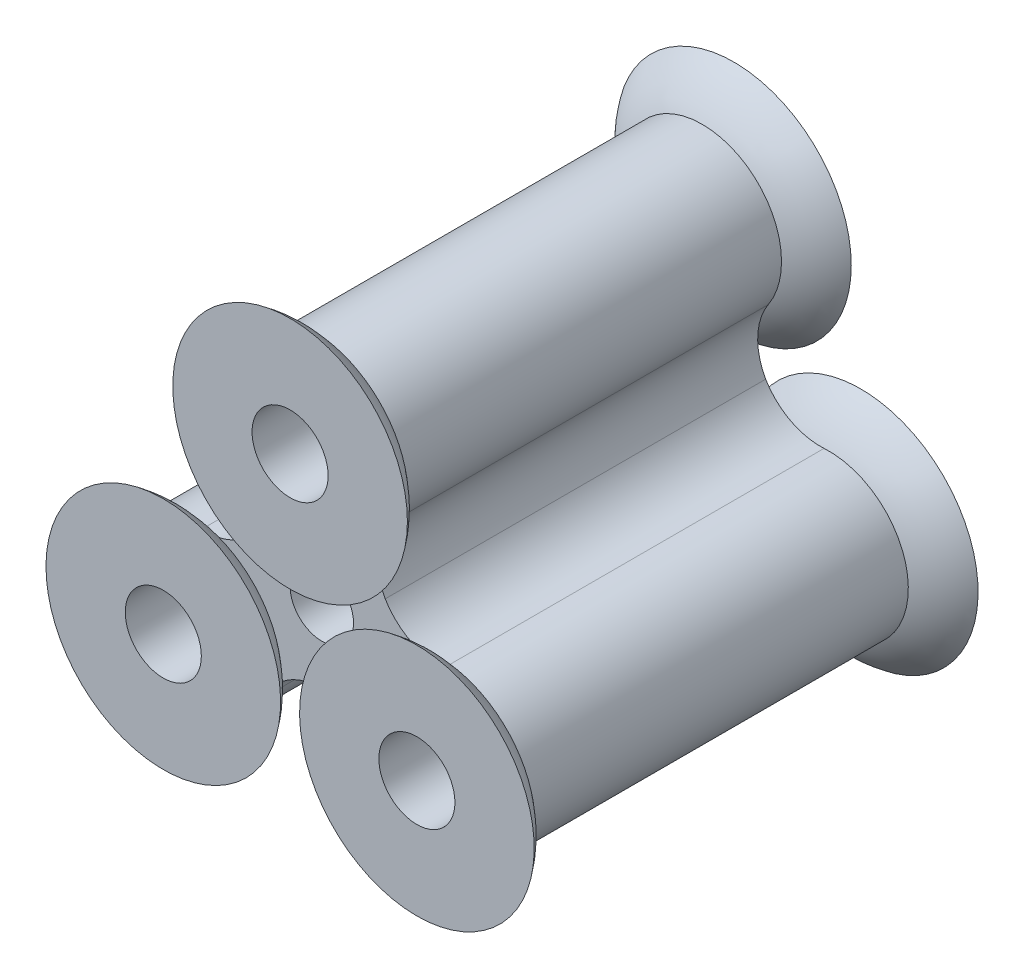
ISO-10303-21;
HEADER;
FILE_DESCRIPTION(('STEP AP214'),'2;1');
FILE_NAME('part.step','',(''),(''),'','','');
FILE_SCHEMA(('AUTOMOTIVE_DESIGN { 1 0 10303 214 1 1 1 1 }'));
ENDSEC;
DATA;
#1=APPLICATION_CONTEXT('core data for automotive mechanical design processes');
#2=APPLICATION_PROTOCOL_DEFINITION('international standard','automotive_design',2000,#1);
#3=PRODUCT_CONTEXT('',#1,'mechanical');
#4=PRODUCT('Part','Part','',(#3));
#5=PRODUCT_RELATED_PRODUCT_CATEGORY('part','',(#4));
#6=PRODUCT_DEFINITION_FORMATION('','',#4);
#7=PRODUCT_DEFINITION_CONTEXT('part definition',#1,'design');
#8=PRODUCT_DEFINITION('design','',#6,#7);
#9=PRODUCT_DEFINITION_SHAPE('','',#8);
#10=(LENGTH_UNIT() NAMED_UNIT(*) SI_UNIT(.MILLI.,.METRE.));
#11=(NAMED_UNIT(*) PLANE_ANGLE_UNIT() SI_UNIT($,.RADIAN.));
#12=(NAMED_UNIT(*) SI_UNIT($,.STERADIAN.) SOLID_ANGLE_UNIT());
#13=UNCERTAINTY_MEASURE_WITH_UNIT(LENGTH_MEASURE(1.E-05),#10,'distance_accuracy_value','');
#14=(GEOMETRIC_REPRESENTATION_CONTEXT(3) GLOBAL_UNCERTAINTY_ASSIGNED_CONTEXT((#13)) GLOBAL_UNIT_ASSIGNED_CONTEXT((#10,
#11,#12)) REPRESENTATION_CONTEXT('',''));
#15=CARTESIAN_POINT('',(0.,0.,0.));
#16=DIRECTION('',(0.,0.,1.));
#17=DIRECTION('',(1.,0.,0.));
#18=AXIS2_PLACEMENT_3D('',#15,#16,#17);
#19=CARTESIAN_POINT('',(0.,0.,0.));
#20=DIRECTION('',(0.,0.,1.));
#21=DIRECTION('',(1.,0.,0.));
#22=AXIS2_PLACEMENT_3D('',#19,#20,#21);
#23=PLANE('',#22);
#24=CARTESIAN_POINT('',(0.,0.,0.));
#25=DIRECTION('',(0.,0.,1.));
#26=DIRECTION('',(1.,0.,0.));
#27=AXIS2_PLACEMENT_3D('',#24,#25,#26);
#28=CIRCLE('',#27,5.);
#29=CARTESIAN_POINT('',(5.,0.,0.));
#30=VERTEX_POINT('',#29);
#31=EDGE_CURVE('E209',#30,#30,#28,.T.);
#32=ORIENTED_EDGE('',*,*,#31,.T.);
#33=EDGE_LOOP('',(#32));
#34=FACE_BOUND('',#33,.T.);
#35=CARTESIAN_POINT('',(-19.9965265733828,-11.5449999999998,0.));
#36=DIRECTION('',(0.,0.,1.));
#37=DIRECTION('',(-0.499999999999992,0.866025403784443,0.));
#38=AXIS2_PLACEMENT_3D('',#35,#36,#37);
#39=CIRCLE('',#38,12.5);
#40=CARTESIAN_POINT('',(-8.64441948630791,-16.7775581395351,0.));
#41=VERTEX_POINT('',#40);
#42=CARTESIAN_POINT('',(-18.8520013054618,0.902492193655265,0.));
#43=VERTEX_POINT('',#42);
#44=EDGE_CURVE('E132',#41,#43,#39,.T.);
#45=ORIENTED_EDGE('',*,*,#44,.T.);
#46=CARTESIAN_POINT('',(-18.0279431125587,9.86468657308693,0.));
#47=DIRECTION('',(0.,0.,1.));
#48=DIRECTION('',(1.,0.,0.));
#49=AXIS2_PLACEMENT_3D('',#46,#47,#48);
#50=CIRCLE('',#49,9.);
#51=CARTESIAN_POINT('',(-10.2337144784988,5.36468657308693,0.));
#52=VERTEX_POINT('',#51);
#53=EDGE_CURVE('E145',#43,#52,#50,.T.);
#54=ORIENTED_EDGE('',*,*,#53,.T.);
#55=DIRECTION('',(-0.5,-0.866025403784439,0.));
#56=VECTOR('',#55,1.);
#57=CARTESIAN_POINT('',(-9.99826328669134,5.7725,0.));
#58=LINE('',#57,#56);
#59=CARTESIAN_POINT('',(-9.76281209488331,6.18031342691416,0.));
#60=VERTEX_POINT('',#59);
#61=EDGE_CURVE('E140',#60,#52,#58,.T.);
#62=ORIENTED_EDGE('',*,*,#61,.F.);
#63=CARTESIAN_POINT('',(-17.5570407289433,10.6803134269142,0.));
#64=DIRECTION('',(0.,0.,1.));
#65=DIRECTION('',(1.,0.,0.));
#66=AXIS2_PLACEMENT_3D('',#63,#64,#65);
#67=CIRCLE('',#66,9.);
#68=CARTESIAN_POINT('',(-10.2075818191531,15.8750659458803,0.));
#69=VERTEX_POINT('',#68);
#70=EDGE_CURVE('E187',#60,#69,#67,.T.);
#71=ORIENTED_EDGE('',*,*,#70,.T.);
#72=CARTESIAN_POINT('',(0.,23.09,0.));
#73=DIRECTION('',(0.,0.,1.));
#74=DIRECTION('',(1.,0.,0.));
#75=AXIS2_PLACEMENT_3D('',#72,#73,#74);
#76=CIRCLE('',#75,12.5);
#77=CARTESIAN_POINT('',(10.410042346232,16.1703888584938,0.));
#78=VERTEX_POINT('',#77);
#79=EDGE_CURVE('E419',#69,#78,#76,.T.);
#80=ORIENTED_EDGE('',*,*,#79,.T.);
#81=CARTESIAN_POINT('',(18.7380762232176,10.6346999452888,0.));
#82=DIRECTION('',(0.,0.,1.));
#83=DIRECTION('',(1.,0.,0.));
#84=AXIS2_PLACEMENT_3D('',#81,#82,#83);
#85=CIRCLE('',#84,10.);
#86=CARTESIAN_POINT('',(9.99935967815187,5.77313300190576,0.));
#87=VERTEX_POINT('',#86);
#88=EDGE_CURVE('E285',#78,#87,#85,.T.);
#89=ORIENTED_EDGE('',*,*,#88,.T.);
#90=CARTESIAN_POINT('',(18.578958425853,10.9103000547128,0.));
#91=DIRECTION('',(0.,0.,1.));
#92=DIRECTION('',(1.,0.,0.));
#93=AXIS2_PLACEMENT_3D('',#90,#91,#92);
#94=CIRCLE('',#93,10.);
#95=CARTESIAN_POINT('',(19.2089887136439,0.930166697063389,0.));
#96=VERTEX_POINT('',#95);
#97=EDGE_CURVE('E279',#87,#96,#94,.T.);
#98=ORIENTED_EDGE('',*,*,#97,.T.);
#99=CARTESIAN_POINT('',(19.9965265733826,-11.5450000000001,0.));
#100=DIRECTION('',(0.,0.,1.));
#101=DIRECTION('',(-0.500000000000004,-0.866025403784436,0.));
#102=AXIS2_PLACEMENT_3D('',#99,#100,#101);
#103=CIRCLE('',#102,12.5);
#104=CARTESIAN_POINT('',(8.64441948630801,-16.7775581395349,0.));
#105=VERTEX_POINT('',#104);
#106=EDGE_CURVE('E203',#96,#105,#103,.T.);
#107=ORIENTED_EDGE('',*,*,#106,.T.);
#108=CARTESIAN_POINT('',(0.470902383614271,-20.545,0.));
#109=DIRECTION('',(0.,0.,1.));
#110=DIRECTION('',(1.,0.,0.));
#111=AXIS2_PLACEMENT_3D('',#108,#109,#110);
#112=CIRCLE('',#111,9.);
#113=CARTESIAN_POINT('',(0.470902383614272,-11.545,0.));
#114=VERTEX_POINT('',#113);
#115=EDGE_CURVE('E54',#105,#114,#112,.T.);
#116=ORIENTED_EDGE('',*,*,#115,.T.);
#117=DIRECTION('',(1.,0.,0.));
#118=VECTOR('',#117,1.);
#119=CARTESIAN_POINT('',(0.,-11.545,0.));
#120=LINE('',#119,#118);
#121=CARTESIAN_POINT('',(-0.470902383614812,-11.545,0.));
#122=VERTEX_POINT('',#121);
#123=EDGE_CURVE('E139',#122,#114,#120,.T.);
#124=ORIENTED_EDGE('',*,*,#123,.F.);
#125=CARTESIAN_POINT('',(-0.470902383614812,-20.545,0.));
#126=DIRECTION('',(0.,0.,1.));
#127=DIRECTION('',(1.,0.,0.));
#128=AXIS2_PLACEMENT_3D('',#125,#126,#127);
#129=CIRCLE('',#128,9.);
#130=EDGE_CURVE('E148',#122,#41,#129,.T.);
#131=ORIENTED_EDGE('',*,*,#130,.T.);
#132=EDGE_LOOP('',(#45,#54,#62,#71,#80,#89,#98,#107,#116,#124,#131));
#133=FACE_BOUND('',#132,.T.);
#134=ADVANCED_FACE('F45',(#34,#133),#23,.F.);
#135=CARTESIAN_POINT('',(0.,0.,60.));
#136=DIRECTION('',(0.,0.,1.));
#137=DIRECTION('',(1.,0.,0.));
#138=AXIS2_PLACEMENT_3D('',#135,#136,#137);
#139=PLANE('',#138);
#140=CARTESIAN_POINT('',(0.,0.,60.));
#141=DIRECTION('',(0.,0.,1.));
#142=DIRECTION('',(1.,0.,0.));
#143=AXIS2_PLACEMENT_3D('',#140,#141,#142);
#144=CIRCLE('',#143,5.);
#145=CARTESIAN_POINT('',(5.,0.,60.));
#146=VERTEX_POINT('',#145);
#147=EDGE_CURVE('E256',#146,#146,#144,.T.);
#148=ORIENTED_EDGE('',*,*,#147,.F.);
#149=EDGE_LOOP('',(#148));
#150=FACE_BOUND('',#149,.T.);
#151=CARTESIAN_POINT('',(-18.0279431125587,9.86468657308693,60.));
#152=DIRECTION('',(0.,0.,1.));
#153=DIRECTION('',(1.,0.,0.));
#154=AXIS2_PLACEMENT_3D('',#151,#152,#153);
#155=CIRCLE('',#154,9.);
#156=CARTESIAN_POINT('',(-10.2337144784988,5.36468657308693,60.));
#157=VERTEX_POINT('',#156);
#158=CARTESIAN_POINT('',(-18.8520013054617,0.902492193655662,60.));
#159=VERTEX_POINT('',#158);
#160=EDGE_CURVE('E162',#157,#159,#155,.F.);
#161=ORIENTED_EDGE('',*,*,#160,.T.);
#162=CARTESIAN_POINT('',(-19.9965265733828,-11.5449999999998,60.));
#163=DIRECTION('',(0.,0.,1.));
#164=DIRECTION('',(-0.499999999999992,0.866025403784443,0.));
#165=AXIS2_PLACEMENT_3D('',#162,#163,#164);
#166=CIRCLE('',#165,12.5);
#167=CARTESIAN_POINT('',(-8.64441948630839,-16.7775581395348,60.));
#168=VERTEX_POINT('',#167);
#169=EDGE_CURVE('E380',#168,#159,#166,.T.);
#170=ORIENTED_EDGE('',*,*,#169,.F.);
#171=CARTESIAN_POINT('',(-0.470902383614812,-20.545,60.));
#172=DIRECTION('',(0.,0.,1.));
#173=DIRECTION('',(1.,0.,0.));
#174=AXIS2_PLACEMENT_3D('',#171,#172,#173);
#175=CIRCLE('',#174,9.);
#176=CARTESIAN_POINT('',(-0.470902383614812,-11.545,60.));
#177=VERTEX_POINT('',#176);
#178=EDGE_CURVE('E197',#168,#177,#175,.F.);
#179=ORIENTED_EDGE('',*,*,#178,.T.);
#180=DIRECTION('',(1.,0.,0.));
#181=VECTOR('',#180,1.);
#182=CARTESIAN_POINT('',(0.,-11.545,60.));
#183=LINE('',#182,#181);
#184=CARTESIAN_POINT('',(0.470902383614272,-11.545,60.));
#185=VERTEX_POINT('',#184);
#186=EDGE_CURVE('E253',#177,#185,#183,.T.);
#187=ORIENTED_EDGE('',*,*,#186,.T.);
#188=CARTESIAN_POINT('',(0.470902383614271,-20.545,60.));
#189=DIRECTION('',(0.,0.,1.));
#190=DIRECTION('',(1.,0.,0.));
#191=AXIS2_PLACEMENT_3D('',#188,#189,#190);
#192=CIRCLE('',#191,9.);
#193=CARTESIAN_POINT('',(8.64441948630741,-16.7775581395352,60.));
#194=VERTEX_POINT('',#193);
#195=EDGE_CURVE('E11',#185,#194,#192,.F.);
#196=ORIENTED_EDGE('',*,*,#195,.T.);
#197=CARTESIAN_POINT('',(19.9965265733826,-11.5450000000001,60.));
#198=DIRECTION('',(0.,0.,1.));
#199=DIRECTION('',(-0.500000000000004,-0.866025403784436,0.));
#200=AXIS2_PLACEMENT_3D('',#197,#198,#199);
#201=CIRCLE('',#200,12.5);
#202=CARTESIAN_POINT('',(19.2089887136439,0.930166697062611,60.));
#203=VERTEX_POINT('',#202);
#204=EDGE_CURVE('E216',#203,#194,#201,.T.);
#205=ORIENTED_EDGE('',*,*,#204,.F.);
#206=CARTESIAN_POINT('',(18.578958425853,10.9103000547128,60.));
#207=DIRECTION('',(0.,0.,1.));
#208=DIRECTION('',(1.,0.,0.));
#209=AXIS2_PLACEMENT_3D('',#206,#207,#208);
#210=CIRCLE('',#209,10.);
#211=CARTESIAN_POINT('',(9.99935967815187,5.77313300190576,60.));
#212=VERTEX_POINT('',#211);
#213=EDGE_CURVE('E282',#203,#212,#210,.F.);
#214=ORIENTED_EDGE('',*,*,#213,.T.);
#215=CARTESIAN_POINT('',(18.7380762232176,10.6346999452888,60.));
#216=DIRECTION('',(0.,0.,1.));
#217=DIRECTION('',(1.,0.,0.));
#218=AXIS2_PLACEMENT_3D('',#215,#216,#217);
#219=CIRCLE('',#218,10.);
#220=CARTESIAN_POINT('',(10.410042346232,16.1703888584938,60.));
#221=VERTEX_POINT('',#220);
#222=EDGE_CURVE('E288',#212,#221,#219,.F.);
#223=ORIENTED_EDGE('',*,*,#222,.T.);
#224=CARTESIAN_POINT('',(0.,23.09,60.));
#225=DIRECTION('',(0.,0.,1.));
#226=DIRECTION('',(1.,0.,0.));
#227=AXIS2_PLACEMENT_3D('',#224,#225,#226);
#228=CIRCLE('',#227,12.5);
#229=CARTESIAN_POINT('',(-10.2075818191531,15.8750659458803,60.));
#230=VERTEX_POINT('',#229);
#231=EDGE_CURVE('E236',#230,#221,#228,.T.);
#232=ORIENTED_EDGE('',*,*,#231,.F.);
#233=CARTESIAN_POINT('',(-17.5570407289433,10.6803134269142,60.));
#234=DIRECTION('',(0.,0.,1.));
#235=DIRECTION('',(1.,0.,0.));
#236=AXIS2_PLACEMENT_3D('',#233,#234,#235);
#237=CIRCLE('',#236,9.);
#238=CARTESIAN_POINT('',(-9.76281209488331,6.18031342691416,60.));
#239=VERTEX_POINT('',#238);
#240=EDGE_CURVE('E163',#230,#239,#237,.F.);
#241=ORIENTED_EDGE('',*,*,#240,.T.);
#242=DIRECTION('',(-0.5,-0.866025403784439,0.));
#243=VECTOR('',#242,1.);
#244=CARTESIAN_POINT('',(-9.99826328669134,5.7725,60.));
#245=LINE('',#244,#243);
#246=EDGE_CURVE('E247',#239,#157,#245,.T.);
#247=ORIENTED_EDGE('',*,*,#246,.T.);
#248=EDGE_LOOP('',(#161,#170,#179,#187,#196,#205,#214,#223,#232,#241,#247));
#249=FACE_BOUND('',#248,.T.);
#250=ADVANCED_FACE('F308',(#150,#249),#139,.T.);
#251=CARTESIAN_POINT('',(19.9965265733827,-11.545,60.));
#252=DIRECTION('',(0.,0.,-1.));
#253=DIRECTION('',(-1.,0.,0.));
#254=AXIS2_PLACEMENT_3D('',#251,#252,#253);
#255=CYLINDRICAL_SURFACE('',#254,12.5000000000016);
#256=CARTESIAN_POINT('',(19.9965265733827,-11.545,60.));
#257=DIRECTION('',(0.,0.,1.));
#258=DIRECTION('',(1.,0.,0.));
#259=AXIS2_PLACEMENT_3D('',#256,#257,#258);
#260=CIRCLE('',#259,12.5000000000016);
#261=EDGE_CURVE('E218',#194,#203,#260,.T.);
#262=ORIENTED_EDGE('',*,*,#261,.F.);
#263=DIRECTION('',(0.,0.,-1.));
#264=VECTOR('',#263,1.);
#265=CARTESIAN_POINT('',(8.64441948630741,-16.7775581395352,60.));
#266=LINE('',#265,#264);
#267=EDGE_CURVE('E183',#194,#105,#266,.T.);
#268=ORIENTED_EDGE('',*,*,#267,.T.);
#269=CARTESIAN_POINT('',(19.9965265733827,-11.545,0.));
#270=DIRECTION('',(0.,0.,1.));
#271=DIRECTION('',(1.,0.,0.));
#272=AXIS2_PLACEMENT_3D('',#269,#270,#271);
#273=CIRCLE('',#272,12.5000000000016);
#274=EDGE_CURVE('E261',#105,#96,#273,.T.);
#275=ORIENTED_EDGE('',*,*,#274,.T.);
#276=DIRECTION('',(0.,0.,-1.));
#277=VECTOR('',#276,1.);
#278=CARTESIAN_POINT('',(19.2089887136439,0.930166697063393,60.));
#279=LINE('',#278,#277);
#280=EDGE_CURVE('E260',#96,#203,#279,.F.);
#281=ORIENTED_EDGE('',*,*,#280,.T.);
#282=EDGE_LOOP('',(#262,#268,#275,#281));
#283=FACE_BOUND('',#282,.T.);
#284=ADVANCED_FACE('F332',(#283),#255,.T.);
#285=CARTESIAN_POINT('',(0.,23.09,60.));
#286=DIRECTION('',(0.,0.,-1.));
#287=DIRECTION('',(-1.,0.,0.));
#288=AXIS2_PLACEMENT_3D('',#285,#286,#287);
#289=CYLINDRICAL_SURFACE('',#288,12.5);
#290=CARTESIAN_POINT('',(0.,23.09,0.));
#291=DIRECTION('',(0.,0.,1.));
#292=DIRECTION('',(1.,0.,0.));
#293=AXIS2_PLACEMENT_3D('',#290,#291,#292);
#294=CIRCLE('',#293,12.5);
#295=EDGE_CURVE('E264',#78,#69,#294,.T.);
#296=ORIENTED_EDGE('',*,*,#295,.T.);
#297=DIRECTION('',(0.,0.,-1.));
#298=VECTOR('',#297,1.);
#299=CARTESIAN_POINT('',(-10.2075818191531,15.8750659458803,60.));
#300=LINE('',#299,#298);
#301=EDGE_CURVE('E176',#69,#230,#300,.F.);
#302=ORIENTED_EDGE('',*,*,#301,.T.);
#303=CARTESIAN_POINT('',(0.,23.09,60.));
#304=DIRECTION('',(0.,0.,1.));
#305=DIRECTION('',(1.,0.,0.));
#306=AXIS2_PLACEMENT_3D('',#303,#304,#305);
#307=CIRCLE('',#306,12.5);
#308=EDGE_CURVE('E243',#221,#230,#307,.T.);
#309=ORIENTED_EDGE('',*,*,#308,.F.);
#310=DIRECTION('',(0.,0.,-1.));
#311=VECTOR('',#310,1.);
#312=CARTESIAN_POINT('',(10.410042346232,16.1703888584938,60.));
#313=LINE('',#312,#311);
#314=EDGE_CURVE('E275',#221,#78,#313,.T.);
#315=ORIENTED_EDGE('',*,*,#314,.T.);
#316=EDGE_LOOP('',(#296,#302,#309,#315));
#317=FACE_BOUND('',#316,.T.);
#318=ADVANCED_FACE('F305',(#317),#289,.T.);
#319=CARTESIAN_POINT('',(-9.99826328669134,5.7725,60.));
#320=DIRECTION('',(0.866025403784439,-0.5,0.));
#321=DIRECTION('',(0.5,0.866025403784439,0.));
#322=AXIS2_PLACEMENT_3D('',#319,#320,#321);
#323=PLANE('',#322);
#324=ORIENTED_EDGE('',*,*,#246,.F.);
#325=DIRECTION('',(0.,0.,1.));
#326=VECTOR('',#325,1.);
#327=CARTESIAN_POINT('',(-9.76281209488331,6.18031342691416,0.));
#328=LINE('',#327,#326);
#329=EDGE_CURVE('E296',#239,#60,#328,.F.);
#330=ORIENTED_EDGE('',*,*,#329,.T.);
#331=ORIENTED_EDGE('',*,*,#61,.T.);
#332=DIRECTION('',(0.,0.,1.));
#333=VECTOR('',#332,1.);
#334=CARTESIAN_POINT('',(-10.2337144784988,5.36468657308693,60.));
#335=LINE('',#334,#333);
#336=EDGE_CURVE('E160',#52,#157,#335,.T.);
#337=ORIENTED_EDGE('',*,*,#336,.T.);
#338=EDGE_LOOP('',(#324,#330,#331,#337));
#339=FACE_BOUND('',#338,.T.);
#340=ADVANCED_FACE('F356',(#339),#323,.F.);
#341=CARTESIAN_POINT('',(-19.9965265733827,-11.545,60.));
#342=DIRECTION('',(0.,0.,-1.));
#343=DIRECTION('',(-1.,0.,0.));
#344=AXIS2_PLACEMENT_3D('',#341,#342,#343);
#345=CYLINDRICAL_SURFACE('',#344,12.5000000000011);
#346=CARTESIAN_POINT('',(-19.9965265733827,-11.545,60.));
#347=DIRECTION('',(0.,0.,1.));
#348=DIRECTION('',(1.,0.,0.));
#349=AXIS2_PLACEMENT_3D('',#346,#347,#348);
#350=CIRCLE('',#349,12.5000000000011);
#351=EDGE_CURVE('E168',#159,#168,#350,.T.);
#352=ORIENTED_EDGE('',*,*,#351,.F.);
#353=DIRECTION('',(0.,0.,-1.));
#354=VECTOR('',#353,1.);
#355=CARTESIAN_POINT('',(-18.8520013054617,0.902492193655662,60.));
#356=LINE('',#355,#354);
#357=EDGE_CURVE('E158',#159,#43,#356,.T.);
#358=ORIENTED_EDGE('',*,*,#357,.T.);
#359=CARTESIAN_POINT('',(-19.9965265733827,-11.545,0.));
#360=DIRECTION('',(0.,0.,1.));
#361=DIRECTION('',(1.,0.,0.));
#362=AXIS2_PLACEMENT_3D('',#359,#360,#361);
#363=CIRCLE('',#362,12.5000000000011);
#364=EDGE_CURVE('E129',#43,#41,#363,.T.);
#365=ORIENTED_EDGE('',*,*,#364,.T.);
#366=DIRECTION('',(0.,0.,-1.));
#367=VECTOR('',#366,1.);
#368=CARTESIAN_POINT('',(-8.64441948630791,-16.7775581395351,60.));
#369=LINE('',#368,#367);
#370=EDGE_CURVE('E170',#41,#168,#369,.F.);
#371=ORIENTED_EDGE('',*,*,#370,.T.);
#372=EDGE_LOOP('',(#352,#358,#365,#371));
#373=FACE_BOUND('',#372,.T.);
#374=ADVANCED_FACE('F166',(#373),#345,.T.);
#375=CARTESIAN_POINT('',(0.,23.09,60.));
#376=DIRECTION('',(0.,0.,-1.));
#377=DIRECTION('',(-1.,0.,0.));
#378=AXIS2_PLACEMENT_3D('',#375,#376,#377);
#379=CYLINDRICAL_SURFACE('',#378,6.);
#380=CARTESIAN_POINT('',(0.,23.09,-4.99999999999999));
#381=DIRECTION('',(0.,0.,1.));
#382=DIRECTION('',(1.,0.,0.));
#383=AXIS2_PLACEMENT_3D('',#380,#381,#382);
#384=CIRCLE('',#383,6.);
#385=CARTESIAN_POINT('',(6.,23.09,-4.99999999999999));
#386=VERTEX_POINT('',#385);
#387=EDGE_CURVE('E423',#386,#386,#384,.T.);
#388=ORIENTED_EDGE('',*,*,#387,.F.);
#389=EDGE_LOOP('',(#388));
#390=FACE_BOUND('',#389,.T.);
#391=CARTESIAN_POINT('',(0.,23.09,65.));
#392=DIRECTION('',(0.,0.,1.));
#393=DIRECTION('',(1.,0.,0.));
#394=AXIS2_PLACEMENT_3D('',#391,#392,#393);
#395=CIRCLE('',#394,6.);
#396=CARTESIAN_POINT('',(6.,23.09,65.));
#397=VERTEX_POINT('',#396);
#398=EDGE_CURVE('E226',#397,#397,#395,.T.);
#399=ORIENTED_EDGE('',*,*,#398,.T.);
#400=EDGE_LOOP('',(#399));
#401=FACE_BOUND('',#400,.T.);
#402=ADVANCED_FACE('F340',(#390,#401),#379,.F.);
#403=CARTESIAN_POINT('',(-19.9965265733827,-11.545,60.));
#404=DIRECTION('',(0.,0.,-1.));
#405=DIRECTION('',(-1.,0.,0.));
#406=AXIS2_PLACEMENT_3D('',#403,#404,#405);
#407=CYLINDRICAL_SURFACE('',#406,6.00000000000112);
#408=CARTESIAN_POINT('',(-19.9965265733828,-11.5449999999998,65.));
#409=DIRECTION('',(0.,0.,1.));
#410=DIRECTION('',(-0.499999999999992,0.866025403784443,0.));
#411=AXIS2_PLACEMENT_3D('',#408,#409,#410);
#412=CIRCLE('',#411,6.);
#413=CARTESIAN_POINT('',(-22.9965265733828,-6.34884757729316,65.));
#414=VERTEX_POINT('',#413);
#415=EDGE_CURVE('E383',#414,#414,#412,.T.);
#416=ORIENTED_EDGE('',*,*,#415,.T.);
#417=EDGE_LOOP('',(#416));
#418=FACE_BOUND('',#417,.T.);
#419=CARTESIAN_POINT('',(-19.9965265733828,-11.5449999999998,-4.99999999999999));
#420=DIRECTION('',(0.,0.,1.));
#421=DIRECTION('',(-0.499999999999992,0.866025403784443,0.));
#422=AXIS2_PLACEMENT_3D('',#419,#420,#421);
#423=CIRCLE('',#422,6.);
#424=CARTESIAN_POINT('',(-22.9965265733828,-6.34884757729316,-4.99999999999999));
#425=VERTEX_POINT('',#424);
#426=EDGE_CURVE('E151',#425,#425,#423,.T.);
#427=ORIENTED_EDGE('',*,*,#426,.F.);
#428=EDGE_LOOP('',(#427));
#429=FACE_BOUND('',#428,.T.);
#430=ADVANCED_FACE('F343',(#418,#429),#407,.F.);
#431=CARTESIAN_POINT('',(19.9965265733827,-11.545,60.));
#432=DIRECTION('',(0.,0.,-1.));
#433=DIRECTION('',(-1.,0.,0.));
#434=AXIS2_PLACEMENT_3D('',#431,#432,#433);
#435=CYLINDRICAL_SURFACE('',#434,6.00000000000163);
#436=CARTESIAN_POINT('',(19.9965265733826,-11.5450000000001,65.));
#437=DIRECTION('',(0.,0.,1.));
#438=DIRECTION('',(-0.500000000000004,-0.866025403784436,0.));
#439=AXIS2_PLACEMENT_3D('',#436,#437,#438);
#440=CIRCLE('',#439,6.);
#441=CARTESIAN_POINT('',(16.9965265733826,-16.7411524227067,65.));
#442=VERTEX_POINT('',#441);
#443=EDGE_CURVE('E221',#442,#442,#440,.T.);
#444=ORIENTED_EDGE('',*,*,#443,.T.);
#445=EDGE_LOOP('',(#444));
#446=FACE_BOUND('',#445,.T.);
#447=CARTESIAN_POINT('',(19.9965265733826,-11.5450000000001,-4.99999999999999));
#448=DIRECTION('',(0.,0.,1.));
#449=DIRECTION('',(-0.500000000000004,-0.866025403784436,0.));
#450=AXIS2_PLACEMENT_3D('',#447,#448,#449);
#451=CIRCLE('',#450,6.);
#452=CARTESIAN_POINT('',(16.9965265733826,-16.7411524227067,-4.99999999999999));
#453=VERTEX_POINT('',#452);
#454=EDGE_CURVE('E433',#453,#453,#451,.T.);
#455=ORIENTED_EDGE('',*,*,#454,.F.);
#456=EDGE_LOOP('',(#455));
#457=FACE_BOUND('',#456,.T.);
#458=ADVANCED_FACE('F347',(#446,#457),#435,.F.);
#459=CARTESIAN_POINT('',(0.,-11.545,60.));
#460=DIRECTION('',(0.,1.,0.));
#461=DIRECTION('',(-1.,0.,0.));
#462=AXIS2_PLACEMENT_3D('',#459,#460,#461);
#463=PLANE('',#462);
#464=ORIENTED_EDGE('',*,*,#186,.F.);
#465=DIRECTION('',(0.,0.,1.));
#466=VECTOR('',#465,1.);
#467=CARTESIAN_POINT('',(-0.470902383614812,-11.545,0.));
#468=LINE('',#467,#466);
#469=EDGE_CURVE('E174',#177,#122,#468,.F.);
#470=ORIENTED_EDGE('',*,*,#469,.T.);
#471=ORIENTED_EDGE('',*,*,#123,.T.);
#472=DIRECTION('',(0.,0.,1.));
#473=VECTOR('',#472,1.);
#474=CARTESIAN_POINT('',(0.470902383614272,-11.545,60.));
#475=LINE('',#474,#473);
#476=EDGE_CURVE('E67',#114,#185,#475,.T.);
#477=ORIENTED_EDGE('',*,*,#476,.T.);
#478=EDGE_LOOP('',(#464,#470,#471,#477));
#479=FACE_BOUND('',#478,.T.);
#480=ADVANCED_FACE('F206',(#479),#463,.F.);
#481=CARTESIAN_POINT('',(0.,0.,60.));
#482=DIRECTION('',(0.,0.,-1.));
#483=DIRECTION('',(-1.,0.,0.));
#484=AXIS2_PLACEMENT_3D('',#481,#482,#483);
#485=CYLINDRICAL_SURFACE('',#484,5.);
#486=ORIENTED_EDGE('',*,*,#147,.T.);
#487=EDGE_LOOP('',(#486));
#488=FACE_BOUND('',#487,.T.);
#489=ORIENTED_EDGE('',*,*,#31,.F.);
#490=EDGE_LOOP('',(#489));
#491=FACE_BOUND('',#490,.T.);
#492=ADVANCED_FACE('F335',(#488,#491),#485,.F.);
#493=CARTESIAN_POINT('',(18.7380762232176,10.6346999452888,60.));
#494=DIRECTION('',(0.,0.,-1.));
#495=DIRECTION('',(-1.,0.,0.));
#496=AXIS2_PLACEMENT_3D('',#493,#494,#495);
#497=CYLINDRICAL_SURFACE('',#496,10.);
#498=ORIENTED_EDGE('',*,*,#314,.F.);
#499=ORIENTED_EDGE('',*,*,#222,.F.);
#500=DIRECTION('',(0.,0.,-1.));
#501=VECTOR('',#500,1.);
#502=CARTESIAN_POINT('',(9.99935967815187,5.77313300190576,30.));
#503=LINE('',#502,#501);
#504=EDGE_CURVE('E240',#87,#212,#503,.F.);
#505=ORIENTED_EDGE('',*,*,#504,.F.);
#506=ORIENTED_EDGE('',*,*,#88,.F.);
#507=EDGE_LOOP('',(#498,#499,#505,#506));
#508=FACE_BOUND('',#507,.T.);
#509=ADVANCED_FACE('F338',(#508),#497,.F.);
#510=CARTESIAN_POINT('',(18.578958425853,10.9103000547128,60.));
#511=DIRECTION('',(0.,0.,-1.));
#512=DIRECTION('',(-1.,0.,0.));
#513=AXIS2_PLACEMENT_3D('',#510,#511,#512);
#514=CYLINDRICAL_SURFACE('',#513,10.);
#515=ORIENTED_EDGE('',*,*,#213,.F.);
#516=ORIENTED_EDGE('',*,*,#280,.F.);
#517=ORIENTED_EDGE('',*,*,#97,.F.);
#518=ORIENTED_EDGE('',*,*,#504,.T.);
#519=EDGE_LOOP('',(#515,#516,#517,#518));
#520=FACE_BOUND('',#519,.T.);
#521=ADVANCED_FACE('F364',(#520),#514,.F.);
#522=CARTESIAN_POINT('',(-17.5570407289433,10.6803134269142,60.));
#523=DIRECTION('',(0.,0.,-1.));
#524=DIRECTION('',(-1.,0.,0.));
#525=AXIS2_PLACEMENT_3D('',#522,#523,#524);
#526=CYLINDRICAL_SURFACE('',#525,9.);
#527=ORIENTED_EDGE('',*,*,#240,.F.);
#528=ORIENTED_EDGE('',*,*,#301,.F.);
#529=ORIENTED_EDGE('',*,*,#70,.F.);
#530=ORIENTED_EDGE('',*,*,#329,.F.);
#531=EDGE_LOOP('',(#527,#528,#529,#530));
#532=FACE_BOUND('',#531,.T.);
#533=ADVANCED_FACE('F367',(#532),#526,.F.);
#534=CARTESIAN_POINT('',(-18.0279431125587,9.86468657308693,60.));
#535=DIRECTION('',(0.,0.,-1.));
#536=DIRECTION('',(-1.,0.,0.));
#537=AXIS2_PLACEMENT_3D('',#534,#535,#536);
#538=CYLINDRICAL_SURFACE('',#537,9.);
#539=ORIENTED_EDGE('',*,*,#160,.F.);
#540=ORIENTED_EDGE('',*,*,#336,.F.);
#541=ORIENTED_EDGE('',*,*,#53,.F.);
#542=ORIENTED_EDGE('',*,*,#357,.F.);
#543=EDGE_LOOP('',(#539,#540,#541,#542));
#544=FACE_BOUND('',#543,.T.);
#545=ADVANCED_FACE('F157',(#544),#538,.F.);
#546=CARTESIAN_POINT('',(-0.470902383614812,-20.545,60.));
#547=DIRECTION('',(0.,0.,-1.));
#548=DIRECTION('',(-1.,0.,0.));
#549=AXIS2_PLACEMENT_3D('',#546,#547,#548);
#550=CYLINDRICAL_SURFACE('',#549,9.);
#551=ORIENTED_EDGE('',*,*,#178,.F.);
#552=ORIENTED_EDGE('',*,*,#370,.F.);
#553=ORIENTED_EDGE('',*,*,#130,.F.);
#554=ORIENTED_EDGE('',*,*,#469,.F.);
#555=EDGE_LOOP('',(#551,#552,#553,#554));
#556=FACE_BOUND('',#555,.T.);
#557=ADVANCED_FACE('F323',(#556),#550,.F.);
#558=CARTESIAN_POINT('',(0.470902383614271,-20.545,60.));
#559=DIRECTION('',(0.,0.,-1.));
#560=DIRECTION('',(-1.,0.,0.));
#561=AXIS2_PLACEMENT_3D('',#558,#559,#560);
#562=CYLINDRICAL_SURFACE('',#561,9.);
#563=ORIENTED_EDGE('',*,*,#195,.F.);
#564=ORIENTED_EDGE('',*,*,#476,.F.);
#565=ORIENTED_EDGE('',*,*,#115,.F.);
#566=ORIENTED_EDGE('',*,*,#267,.F.);
#567=EDGE_LOOP('',(#563,#564,#565,#566));
#568=FACE_BOUND('',#567,.T.);
#569=ADVANCED_FACE('F47',(#568),#562,.F.);
#570=CARTESIAN_POINT('',(0.,23.09,73.625955475639));
#571=DIRECTION('',(0.,0.,1.));
#572=DIRECTION('',(1.,0.,0.));
#573=AXIS2_PLACEMENT_3D('',#570,#571,#572);
#574=DEGENERATE_TOROIDAL_SURFACE('',#573,6.2283704369675,15.,.T.);
#575=CARTESIAN_POINT('',(0.,23.09,65.));
#576=DIRECTION('',(0.,0.,1.));
#577=DIRECTION('',(1.,0.,0.));
#578=AXIS2_PLACEMENT_3D('',#575,#576,#577);
#579=CIRCLE('',#578,18.5);
#580=CARTESIAN_POINT('',(18.5,23.09,65.));
#581=VERTEX_POINT('',#580);
#582=EDGE_CURVE('E220',#581,#581,#579,.T.);
#583=ORIENTED_EDGE('',*,*,#582,.F.);
#584=EDGE_LOOP('',(#583));
#585=FACE_BOUND('',#584,.T.);
#586=ORIENTED_EDGE('',*,*,#231,.T.);
#587=ORIENTED_EDGE('',*,*,#308,.T.);
#588=EDGE_LOOP('',(#586,#587));
#589=FACE_BOUND('',#588,.T.);
#590=ADVANCED_FACE('F312',(#585,#589),#574,.T.);
#591=CARTESIAN_POINT('',(0.,29.09,65.));
#592=DIRECTION('',(0.,0.,-1.));
#593=DIRECTION('',(-1.,0.,0.));
#594=AXIS2_PLACEMENT_3D('',#591,#592,#593);
#595=PLANE('',#594);
#596=ORIENTED_EDGE('',*,*,#398,.F.);
#597=EDGE_LOOP('',(#596));
#598=FACE_BOUND('',#597,.T.);
#599=ORIENTED_EDGE('',*,*,#582,.T.);
#600=EDGE_LOOP('',(#599));
#601=FACE_BOUND('',#600,.T.);
#602=ADVANCED_FACE('F314',(#598,#601),#595,.F.);
#603=CARTESIAN_POINT('',(19.9965265733826,-11.5450000000001,73.625955475639));
#604=DIRECTION('',(0.,0.,1.));
#605=DIRECTION('',(-0.500000000000004,-0.866025403784436,0.));
#606=AXIS2_PLACEMENT_3D('',#603,#604,#605);
#607=DEGENERATE_TOROIDAL_SURFACE('',#606,6.2283704369675,15.,.T.);
#608=CARTESIAN_POINT('',(19.9965265733826,-11.5450000000001,65.));
#609=DIRECTION('',(0.,0.,1.));
#610=DIRECTION('',(-0.500000000000004,-0.866025403784436,0.));
#611=AXIS2_PLACEMENT_3D('',#608,#609,#610);
#612=CIRCLE('',#611,18.5);
#613=CARTESIAN_POINT('',(10.7465265733826,-27.5664699700122,65.));
#614=VERTEX_POINT('',#613);
#615=EDGE_CURVE('E229',#614,#614,#612,.T.);
#616=ORIENTED_EDGE('',*,*,#615,.F.);
#617=EDGE_LOOP('',(#616));
#618=FACE_BOUND('',#617,.T.);
#619=ORIENTED_EDGE('',*,*,#204,.T.);
#620=ORIENTED_EDGE('',*,*,#261,.T.);
#621=EDGE_LOOP('',(#619,#620));
#622=FACE_BOUND('',#621,.T.);
#623=ADVANCED_FACE('F217',(#618,#622),#607,.T.);
#624=CARTESIAN_POINT('',(25.1926789960893,-14.5450000000001,65.));
#625=DIRECTION('',(0.,0.,-1.));
#626=DIRECTION('',(0.500000000000004,0.866025403784436,0.));
#627=AXIS2_PLACEMENT_3D('',#624,#625,#626);
#628=PLANE('',#627);
#629=ORIENTED_EDGE('',*,*,#443,.F.);
#630=EDGE_LOOP('',(#629));
#631=FACE_BOUND('',#630,.T.);
#632=ORIENTED_EDGE('',*,*,#615,.T.);
#633=EDGE_LOOP('',(#632));
#634=FACE_BOUND('',#633,.T.);
#635=ADVANCED_FACE('F388',(#631,#634),#628,.F.);
#636=CARTESIAN_POINT('',(-19.9965265733828,-11.5449999999998,73.625955475639));
#637=DIRECTION('',(0.,0.,1.));
#638=DIRECTION('',(-0.499999999999992,0.866025403784443,0.));
#639=AXIS2_PLACEMENT_3D('',#636,#637,#638);
#640=DEGENERATE_TOROIDAL_SURFACE('',#639,6.2283704369675,15.,.T.);
#641=CARTESIAN_POINT('',(-19.9965265733828,-11.5449999999998,65.));
#642=DIRECTION('',(0.,0.,1.));
#643=DIRECTION('',(-0.499999999999992,0.866025403784443,0.));
#644=AXIS2_PLACEMENT_3D('',#641,#642,#643);
#645=CIRCLE('',#644,18.5);
#646=CARTESIAN_POINT('',(-29.2465265733827,4.47646997001239,65.));
#647=VERTEX_POINT('',#646);
#648=EDGE_CURVE('E415',#647,#647,#645,.T.);
#649=ORIENTED_EDGE('',*,*,#648,.F.);
#650=EDGE_LOOP('',(#649));
#651=FACE_BOUND('',#650,.T.);
#652=ORIENTED_EDGE('',*,*,#169,.T.);
#653=ORIENTED_EDGE('',*,*,#351,.T.);
#654=EDGE_LOOP('',(#652,#653));
#655=FACE_BOUND('',#654,.T.);
#656=ADVANCED_FACE('F385',(#651,#655),#640,.T.);
#657=CARTESIAN_POINT('',(-25.1926789960895,-14.5449999999998,65.));
#658=DIRECTION('',(0.,0.,-1.));
#659=DIRECTION('',(0.499999999999992,-0.866025403784443,0.));
#660=AXIS2_PLACEMENT_3D('',#657,#658,#659);
#661=PLANE('',#660);
#662=ORIENTED_EDGE('',*,*,#415,.F.);
#663=EDGE_LOOP('',(#662));
#664=FACE_BOUND('',#663,.T.);
#665=ORIENTED_EDGE('',*,*,#648,.T.);
#666=EDGE_LOOP('',(#665));
#667=FACE_BOUND('',#666,.T.);
#668=ADVANCED_FACE('F387',(#664,#667),#661,.F.);
#669=CARTESIAN_POINT('',(0.,23.09,-13.625955475639));
#670=DIRECTION('',(0.,0.,-1.));
#671=DIRECTION('',(1.,0.,0.));
#672=AXIS2_PLACEMENT_3D('',#669,#670,#671);
#673=DEGENERATE_TOROIDAL_SURFACE('',#672,6.2283704369675,15.,.T.);
#674=CARTESIAN_POINT('',(0.,23.09,-4.99999999999999));
#675=DIRECTION('',(0.,0.,1.));
#676=DIRECTION('',(1.,0.,0.));
#677=AXIS2_PLACEMENT_3D('',#674,#675,#676);
#678=CIRCLE('',#677,18.5);
#679=CARTESIAN_POINT('',(18.5,23.09,-4.99999999999999));
#680=VERTEX_POINT('',#679);
#681=EDGE_CURVE('E427',#680,#680,#678,.T.);
#682=ORIENTED_EDGE('',*,*,#681,.T.);
#683=EDGE_LOOP('',(#682));
#684=FACE_BOUND('',#683,.T.);
#685=ORIENTED_EDGE('',*,*,#79,.F.);
#686=ORIENTED_EDGE('',*,*,#295,.F.);
#687=EDGE_LOOP('',(#685,#686));
#688=FACE_BOUND('',#687,.T.);
#689=ADVANCED_FACE('F395',(#684,#688),#673,.T.);
#690=CARTESIAN_POINT('',(0.,29.09,-4.99999999999999));
#691=DIRECTION('',(0.,0.,1.));
#692=DIRECTION('',(-1.,0.,0.));
#693=AXIS2_PLACEMENT_3D('',#690,#691,#692);
#694=PLANE('',#693);
#695=ORIENTED_EDGE('',*,*,#387,.T.);
#696=EDGE_LOOP('',(#695));
#697=FACE_BOUND('',#696,.T.);
#698=ORIENTED_EDGE('',*,*,#681,.F.);
#699=EDGE_LOOP('',(#698));
#700=FACE_BOUND('',#699,.T.);
#701=ADVANCED_FACE('F465',(#697,#700),#694,.F.);
#702=CARTESIAN_POINT('',(19.9965265733826,-11.5450000000001,-13.625955475639));
#703=DIRECTION('',(0.,0.,-1.));
#704=DIRECTION('',(-0.500000000000004,-0.866025403784436,0.));
#705=AXIS2_PLACEMENT_3D('',#702,#703,#704);
#706=DEGENERATE_TOROIDAL_SURFACE('',#705,6.2283704369675,15.,.T.);
#707=CARTESIAN_POINT('',(19.9965265733826,-11.5450000000001,-4.99999999999999));
#708=DIRECTION('',(0.,0.,1.));
#709=DIRECTION('',(-0.500000000000004,-0.866025403784436,0.));
#710=AXIS2_PLACEMENT_3D('',#707,#708,#709);
#711=CIRCLE('',#710,18.5);
#712=CARTESIAN_POINT('',(10.7465265733826,-27.5664699700122,-4.99999999999999));
#713=VERTEX_POINT('',#712);
#714=EDGE_CURVE('E150',#713,#713,#711,.T.);
#715=ORIENTED_EDGE('',*,*,#714,.T.);
#716=EDGE_LOOP('',(#715));
#717=FACE_BOUND('',#716,.T.);
#718=ORIENTED_EDGE('',*,*,#106,.F.);
#719=ORIENTED_EDGE('',*,*,#274,.F.);
#720=EDGE_LOOP('',(#718,#719));
#721=FACE_BOUND('',#720,.T.);
#722=ADVANCED_FACE('F461',(#717,#721),#706,.T.);
#723=CARTESIAN_POINT('',(25.1926789960893,-14.5450000000001,-4.99999999999999));
#724=DIRECTION('',(0.,0.,1.));
#725=DIRECTION('',(0.500000000000004,0.866025403784436,0.));
#726=AXIS2_PLACEMENT_3D('',#723,#724,#725);
#727=PLANE('',#726);
#728=ORIENTED_EDGE('',*,*,#454,.T.);
#729=EDGE_LOOP('',(#728));
#730=FACE_BOUND('',#729,.T.);
#731=ORIENTED_EDGE('',*,*,#714,.F.);
#732=EDGE_LOOP('',(#731));
#733=FACE_BOUND('',#732,.T.);
#734=ADVANCED_FACE('F456',(#730,#733),#727,.F.);
#735=CARTESIAN_POINT('',(-19.9965265733828,-11.5449999999998,-13.625955475639));
#736=DIRECTION('',(0.,0.,-1.));
#737=DIRECTION('',(-0.499999999999992,0.866025403784443,0.));
#738=AXIS2_PLACEMENT_3D('',#735,#736,#737);
#739=DEGENERATE_TOROIDAL_SURFACE('',#738,6.2283704369675,15.,.T.);
#740=CARTESIAN_POINT('',(-19.9965265733828,-11.5449999999998,-4.99999999999999));
#741=DIRECTION('',(0.,0.,1.));
#742=DIRECTION('',(-0.499999999999992,0.866025403784443,0.));
#743=AXIS2_PLACEMENT_3D('',#740,#741,#742);
#744=CIRCLE('',#743,18.5);
#745=CARTESIAN_POINT('',(-29.2465265733827,4.47646997001239,-4.99999999999999));
#746=VERTEX_POINT('',#745);
#747=EDGE_CURVE('E443',#746,#746,#744,.T.);
#748=ORIENTED_EDGE('',*,*,#747,.T.);
#749=EDGE_LOOP('',(#748));
#750=FACE_BOUND('',#749,.T.);
#751=ORIENTED_EDGE('',*,*,#44,.F.);
#752=ORIENTED_EDGE('',*,*,#364,.F.);
#753=EDGE_LOOP('',(#751,#752));
#754=FACE_BOUND('',#753,.T.);
#755=ADVANCED_FACE('F131',(#750,#754),#739,.T.);
#756=CARTESIAN_POINT('',(-25.1926789960895,-14.5449999999998,-4.99999999999999));
#757=DIRECTION('',(0.,0.,1.));
#758=DIRECTION('',(0.499999999999992,-0.866025403784443,0.));
#759=AXIS2_PLACEMENT_3D('',#756,#757,#758);
#760=PLANE('',#759);
#761=ORIENTED_EDGE('',*,*,#426,.T.);
#762=EDGE_LOOP('',(#761));
#763=FACE_BOUND('',#762,.T.);
#764=ORIENTED_EDGE('',*,*,#747,.F.);
#765=EDGE_LOOP('',(#764));
#766=FACE_BOUND('',#765,.T.);
#767=ADVANCED_FACE('F449',(#763,#766),#760,.F.);
#768=CLOSED_SHELL('',(#134,#250,#284,#318,#340,#374,#402,#430,#458,#480,#492,#509,#521,#533,
#545,#557,#569,#590,#602,#623,#635,#656,#668,#689,#701,#722,#734,#755,#767));
#769=MANIFOLD_SOLID_BREP('B2',#768);
#770=ADVANCED_BREP_SHAPE_REPRESENTATION('',(#18,#769),#14);
#771=SHAPE_DEFINITION_REPRESENTATION(#9,#770);
ENDSEC;
END-ISO-10303-21;
